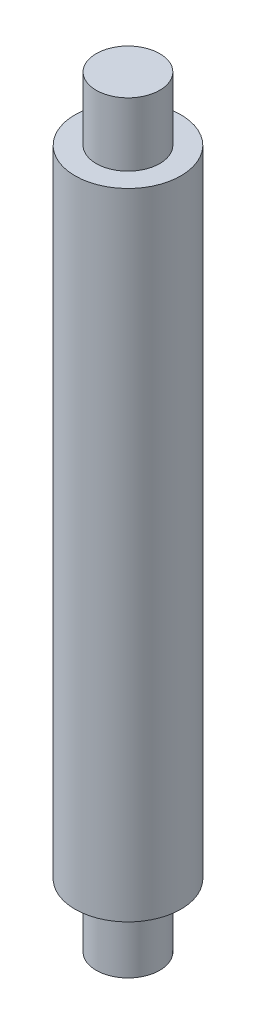
ISO-10303-21;
HEADER;
FILE_DESCRIPTION(('STEP AP214'),'2;1');
FILE_NAME('part.step','',(''),(''),'','','');
FILE_SCHEMA(('AUTOMOTIVE_DESIGN { 1 0 10303 214 1 1 1 1 }'));
ENDSEC;
DATA;
#1=APPLICATION_CONTEXT('core data for automotive mechanical design processes');
#2=APPLICATION_PROTOCOL_DEFINITION('international standard','automotive_design',2000,#1);
#3=PRODUCT_CONTEXT('',#1,'mechanical');
#4=PRODUCT('Part','Part','',(#3));
#5=PRODUCT_RELATED_PRODUCT_CATEGORY('part','',(#4));
#6=PRODUCT_DEFINITION_FORMATION('','',#4);
#7=PRODUCT_DEFINITION_CONTEXT('part definition',#1,'design');
#8=PRODUCT_DEFINITION('design','',#6,#7);
#9=PRODUCT_DEFINITION_SHAPE('','',#8);
#10=(LENGTH_UNIT() NAMED_UNIT(*) SI_UNIT(.MILLI.,.METRE.));
#11=(NAMED_UNIT(*) PLANE_ANGLE_UNIT() SI_UNIT($,.RADIAN.));
#12=(NAMED_UNIT(*) SI_UNIT($,.STERADIAN.) SOLID_ANGLE_UNIT());
#13=UNCERTAINTY_MEASURE_WITH_UNIT(LENGTH_MEASURE(1.E-05),#10,'distance_accuracy_value','');
#14=(GEOMETRIC_REPRESENTATION_CONTEXT(3) GLOBAL_UNCERTAINTY_ASSIGNED_CONTEXT((#13)) GLOBAL_UNIT_ASSIGNED_CONTEXT((#10,
#11,#12)) REPRESENTATION_CONTEXT('',''));
#15=CARTESIAN_POINT('',(0.,0.,0.));
#16=DIRECTION('',(0.,0.,1.));
#17=DIRECTION('',(1.,0.,0.));
#18=AXIS2_PLACEMENT_3D('',#15,#16,#17);
#19=CARTESIAN_POINT('',(0.,-15.,0.));
#20=DIRECTION('',(0.,1.,0.));
#21=DIRECTION('',(0.,0.,1.));
#22=AXIS2_PLACEMENT_3D('',#19,#20,#21);
#23=CYLINDRICAL_SURFACE('',#22,2.5);
#24=CARTESIAN_POINT('',(0.,-15.,0.));
#25=DIRECTION('',(0.,1.,0.));
#26=DIRECTION('',(0.,0.,1.));
#27=AXIS2_PLACEMENT_3D('',#24,#25,#26);
#28=CIRCLE('',#27,2.5);
#29=CARTESIAN_POINT('',(0.,-15.,2.5));
#30=VERTEX_POINT('',#29);
#31=EDGE_CURVE('E49',#30,#30,#28,.T.);
#32=ORIENTED_EDGE('',*,*,#31,.T.);
#33=EDGE_LOOP('',(#32));
#34=FACE_BOUND('',#33,.T.);
#35=CARTESIAN_POINT('',(0.,15.,0.));
#36=DIRECTION('',(0.,1.,0.));
#37=DIRECTION('',(0.,0.,1.));
#38=AXIS2_PLACEMENT_3D('',#35,#36,#37);
#39=CIRCLE('',#38,2.5);
#40=CARTESIAN_POINT('',(0.,15.,2.5));
#41=VERTEX_POINT('',#40);
#42=EDGE_CURVE('E40',#41,#41,#39,.T.);
#43=ORIENTED_EDGE('',*,*,#42,.F.);
#44=EDGE_LOOP('',(#43));
#45=FACE_BOUND('',#44,.T.);
#46=ADVANCED_FACE('F37',(#34,#45),#23,.T.);
#47=CARTESIAN_POINT('',(0.,-15.,0.));
#48=DIRECTION('',(0.,1.,0.));
#49=DIRECTION('',(0.,0.,1.));
#50=AXIS2_PLACEMENT_3D('',#47,#48,#49);
#51=PLANE('',#50);
#52=CARTESIAN_POINT('',(0.,-15.,0.));
#53=DIRECTION('',(0.,-1.,0.));
#54=DIRECTION('',(0.,0.,-1.));
#55=AXIS2_PLACEMENT_3D('',#52,#53,#54);
#56=CIRCLE('',#55,1.5);
#57=CARTESIAN_POINT('',(0.,-15.,-1.5));
#58=VERTEX_POINT('',#57);
#59=EDGE_CURVE('E10',#58,#58,#56,.T.);
#60=ORIENTED_EDGE('',*,*,#59,.F.);
#61=EDGE_LOOP('',(#60));
#62=FACE_BOUND('',#61,.T.);
#63=ORIENTED_EDGE('',*,*,#31,.F.);
#64=EDGE_LOOP('',(#63));
#65=FACE_BOUND('',#64,.T.);
#66=ADVANCED_FACE('F65',(#62,#65),#51,.F.);
#67=CARTESIAN_POINT('',(0.,15.,0.));
#68=DIRECTION('',(0.,1.,0.));
#69=DIRECTION('',(0.,0.,1.));
#70=AXIS2_PLACEMENT_3D('',#67,#68,#69);
#71=PLANE('',#70);
#72=CARTESIAN_POINT('',(0.,15.,0.));
#73=DIRECTION('',(0.,1.,0.));
#74=DIRECTION('',(0.,0.,1.));
#75=AXIS2_PLACEMENT_3D('',#72,#73,#74);
#76=CIRCLE('',#75,1.5);
#77=CARTESIAN_POINT('',(0.,15.,1.5));
#78=VERTEX_POINT('',#77);
#79=EDGE_CURVE('E44',#78,#78,#76,.T.);
#80=ORIENTED_EDGE('',*,*,#79,.F.);
#81=EDGE_LOOP('',(#80));
#82=FACE_BOUND('',#81,.T.);
#83=ORIENTED_EDGE('',*,*,#42,.T.);
#84=EDGE_LOOP('',(#83));
#85=FACE_BOUND('',#84,.T.);
#86=ADVANCED_FACE('F62',(#82,#85),#71,.T.);
#87=CARTESIAN_POINT('',(0.,18.,0.));
#88=DIRECTION('',(0.,-1.,0.));
#89=DIRECTION('',(0.,0.,-1.));
#90=AXIS2_PLACEMENT_3D('',#87,#88,#89);
#91=CYLINDRICAL_SURFACE('',#90,1.5);
#92=CARTESIAN_POINT('',(0.,18.,0.));
#93=DIRECTION('',(0.,1.,0.));
#94=DIRECTION('',(0.,0.,1.));
#95=AXIS2_PLACEMENT_3D('',#92,#93,#94);
#96=CIRCLE('',#95,1.5);
#97=CARTESIAN_POINT('',(0.,18.,1.5));
#98=VERTEX_POINT('',#97);
#99=EDGE_CURVE('E54',#98,#98,#96,.T.);
#100=ORIENTED_EDGE('',*,*,#99,.F.);
#101=EDGE_LOOP('',(#100));
#102=FACE_BOUND('',#101,.T.);
#103=ORIENTED_EDGE('',*,*,#79,.T.);
#104=EDGE_LOOP('',(#103));
#105=FACE_BOUND('',#104,.T.);
#106=ADVANCED_FACE('F74',(#102,#105),#91,.T.);
#107=CARTESIAN_POINT('',(0.,18.,0.));
#108=DIRECTION('',(0.,1.,0.));
#109=DIRECTION('',(0.,0.,1.));
#110=AXIS2_PLACEMENT_3D('',#107,#108,#109);
#111=PLANE('',#110);
#112=ORIENTED_EDGE('',*,*,#99,.T.);
#113=EDGE_LOOP('',(#112));
#114=FACE_BOUND('',#113,.T.);
#115=ADVANCED_FACE('F80',(#114),#111,.T.);
#116=CARTESIAN_POINT('',(0.,-18.,0.));
#117=DIRECTION('',(0.,1.,0.));
#118=DIRECTION('',(0.,0.,1.));
#119=AXIS2_PLACEMENT_3D('',#116,#117,#118);
#120=CYLINDRICAL_SURFACE('',#119,1.5);
#121=CARTESIAN_POINT('',(0.,-18.,0.));
#122=DIRECTION('',(0.,-1.,0.));
#123=DIRECTION('',(0.,0.,-1.));
#124=AXIS2_PLACEMENT_3D('',#121,#122,#123);
#125=CIRCLE('',#124,1.5);
#126=CARTESIAN_POINT('',(0.,-18.,-1.5));
#127=VERTEX_POINT('',#126);
#128=EDGE_CURVE('E53',#127,#127,#125,.T.);
#129=ORIENTED_EDGE('',*,*,#128,.F.);
#130=EDGE_LOOP('',(#129));
#131=FACE_BOUND('',#130,.T.);
#132=ORIENTED_EDGE('',*,*,#59,.T.);
#133=EDGE_LOOP('',(#132));
#134=FACE_BOUND('',#133,.T.);
#135=ADVANCED_FACE('F84',(#131,#134),#120,.T.);
#136=CARTESIAN_POINT('',(0.,-18.,0.));
#137=DIRECTION('',(0.,-1.,0.));
#138=DIRECTION('',(0.,0.,-1.));
#139=AXIS2_PLACEMENT_3D('',#136,#137,#138);
#140=PLANE('',#139);
#141=ORIENTED_EDGE('',*,*,#128,.T.);
#142=EDGE_LOOP('',(#141));
#143=FACE_BOUND('',#142,.T.);
#144=ADVANCED_FACE('F88',(#143),#140,.T.);
#145=CLOSED_SHELL('',(#46,#66,#86,#106,#115,#135,#144));
#146=MANIFOLD_SOLID_BREP('B2',#145);
#147=ADVANCED_BREP_SHAPE_REPRESENTATION('',(#18,#146),#14);
#148=SHAPE_DEFINITION_REPRESENTATION(#9,#147);
ENDSEC;
END-ISO-10303-21;
